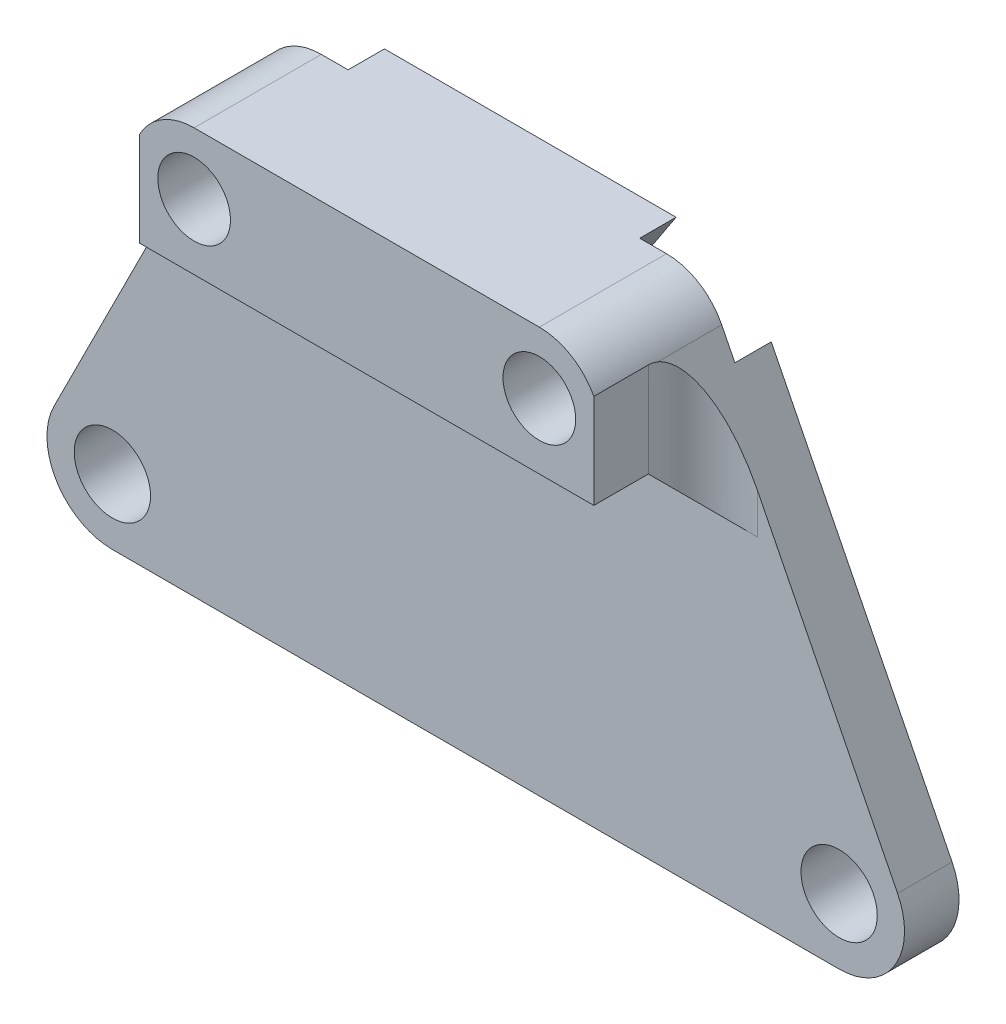
ISO-10303-21;
HEADER;
FILE_DESCRIPTION(('STEP AP214'),'2;1');
FILE_NAME('part.step','',(''),(''),'','','');
FILE_SCHEMA(('AUTOMOTIVE_DESIGN { 1 0 10303 214 1 1 1 1 }'));
ENDSEC;
DATA;
#1=APPLICATION_CONTEXT('core data for automotive mechanical design processes');
#2=APPLICATION_PROTOCOL_DEFINITION('international standard','automotive_design',2000,#1);
#3=PRODUCT_CONTEXT('',#1,'mechanical');
#4=PRODUCT('Part','Part','',(#3));
#5=PRODUCT_RELATED_PRODUCT_CATEGORY('part','',(#4));
#6=PRODUCT_DEFINITION_FORMATION('','',#4);
#7=PRODUCT_DEFINITION_CONTEXT('part definition',#1,'design');
#8=PRODUCT_DEFINITION('design','',#6,#7);
#9=PRODUCT_DEFINITION_SHAPE('','',#8);
#10=(LENGTH_UNIT() NAMED_UNIT(*) SI_UNIT(.MILLI.,.METRE.));
#11=(NAMED_UNIT(*) PLANE_ANGLE_UNIT() SI_UNIT($,.RADIAN.));
#12=(NAMED_UNIT(*) SI_UNIT($,.STERADIAN.) SOLID_ANGLE_UNIT());
#13=UNCERTAINTY_MEASURE_WITH_UNIT(LENGTH_MEASURE(1.E-05),#10,'distance_accuracy_value','');
#14=(GEOMETRIC_REPRESENTATION_CONTEXT(3) GLOBAL_UNCERTAINTY_ASSIGNED_CONTEXT((#13)) GLOBAL_UNIT_ASSIGNED_CONTEXT((#10,
#11,#12)) REPRESENTATION_CONTEXT('',''));
#15=CARTESIAN_POINT('',(0.,0.,0.));
#16=DIRECTION('',(0.,0.,1.));
#17=DIRECTION('',(1.,0.,0.));
#18=AXIS2_PLACEMENT_3D('',#15,#16,#17);
#19=CARTESIAN_POINT('',(36.5,32.6963519956689,3.));
#20=DIRECTION('',(0.,0.,-1.));
#21=DIRECTION('',(-1.,0.,0.));
#22=AXIS2_PLACEMENT_3D('',#19,#20,#21);
#23=CYLINDRICAL_SURFACE('',#22,2.);
#24=CARTESIAN_POINT('',(36.5,32.6963519956689,9.));
#25=DIRECTION('',(0.,0.,1.));
#26=DIRECTION('',(1.,0.,0.));
#27=AXIS2_PLACEMENT_3D('',#24,#25,#26);
#28=CIRCLE('',#27,2.);
#29=CARTESIAN_POINT('',(38.5,32.6963519956689,9.));
#30=VERTEX_POINT('',#29);
#31=EDGE_CURVE('E385',#30,#30,#28,.T.);
#32=ORIENTED_EDGE('',*,*,#31,.T.);
#33=EDGE_LOOP('',(#32));
#34=FACE_BOUND('',#33,.T.);
#35=CARTESIAN_POINT('',(36.5,32.6963519956689,2.));
#36=DIRECTION('',(0.,0.,-1.));
#37=DIRECTION('',(-1.,0.,0.));
#38=AXIS2_PLACEMENT_3D('',#35,#36,#37);
#39=CIRCLE('',#38,2.);
#40=CARTESIAN_POINT('',(34.5,32.6963519956689,2.));
#41=VERTEX_POINT('',#40);
#42=EDGE_CURVE('E296',#41,#41,#39,.T.);
#43=ORIENTED_EDGE('',*,*,#42,.T.);
#44=EDGE_LOOP('',(#43));
#45=FACE_BOUND('',#44,.T.);
#46=ADVANCED_FACE('F41',(#34,#45),#23,.F.);
#47=CARTESIAN_POINT('',(17.5,32.6963519956689,3.));
#48=DIRECTION('',(0.,0.,-1.));
#49=DIRECTION('',(-1.,0.,0.));
#50=AXIS2_PLACEMENT_3D('',#47,#48,#49);
#51=CYLINDRICAL_SURFACE('',#50,2.);
#52=CARTESIAN_POINT('',(17.5,32.6963519956689,9.));
#53=DIRECTION('',(0.,0.,1.));
#54=DIRECTION('',(1.,0.,0.));
#55=AXIS2_PLACEMENT_3D('',#52,#53,#54);
#56=CIRCLE('',#55,2.);
#57=CARTESIAN_POINT('',(19.5,32.6963519956689,9.));
#58=VERTEX_POINT('',#57);
#59=EDGE_CURVE('E389',#58,#58,#56,.T.);
#60=ORIENTED_EDGE('',*,*,#59,.T.);
#61=EDGE_LOOP('',(#60));
#62=FACE_BOUND('',#61,.T.);
#63=CARTESIAN_POINT('',(17.5,32.6963519956689,2.));
#64=DIRECTION('',(0.,0.,-1.));
#65=DIRECTION('',(-1.,0.,0.));
#66=AXIS2_PLACEMENT_3D('',#63,#64,#65);
#67=CIRCLE('',#66,2.);
#68=CARTESIAN_POINT('',(15.5,32.6963519956689,2.));
#69=VERTEX_POINT('',#68);
#70=EDGE_CURVE('E306',#69,#69,#67,.T.);
#71=ORIENTED_EDGE('',*,*,#70,.T.);
#72=EDGE_LOOP('',(#71));
#73=FACE_BOUND('',#72,.T.);
#74=ADVANCED_FACE('F513',(#62,#73),#51,.F.);
#75=CARTESIAN_POINT('',(36.5,32.6963519956689,9.001));
#76=DIRECTION('',(0.,0.,-1.));
#77=DIRECTION('',(-1.,0.,0.));
#78=AXIS2_PLACEMENT_3D('',#75,#76,#77);
#79=CYLINDRICAL_SURFACE('',#78,3.4);
#80=CARTESIAN_POINT('',(36.5,32.6963519956689,2.));
#81=DIRECTION('',(0.,0.,-1.));
#82=DIRECTION('',(-1.,0.,0.));
#83=AXIS2_PLACEMENT_3D('',#80,#81,#82);
#84=CIRCLE('',#83,3.4);
#85=CARTESIAN_POINT('',(36.5,36.0963519956689,2.));
#86=VERTEX_POINT('',#85);
#87=CARTESIAN_POINT('',(39.5382688625457,34.2224327009021,2.));
#88=VERTEX_POINT('',#87);
#89=EDGE_CURVE('E66',#86,#88,#84,.T.);
#90=ORIENTED_EDGE('',*,*,#89,.F.);
#91=DIRECTION('',(0.,0.,-1.));
#92=VECTOR('',#91,1.);
#93=CARTESIAN_POINT('',(36.5,36.0963519956689,9.001));
#94=LINE('',#93,#92);
#95=CARTESIAN_POINT('',(36.5,36.0963519956689,9.));
#96=VERTEX_POINT('',#95);
#97=EDGE_CURVE('E378',#96,#86,#94,.T.);
#98=ORIENTED_EDGE('',*,*,#97,.F.);
#99=CARTESIAN_POINT('',(36.5,32.6963519956689,9.));
#100=DIRECTION('',(0.,0.,-1.));
#101=DIRECTION('',(-1.,0.,0.));
#102=AXIS2_PLACEMENT_3D('',#99,#100,#101);
#103=CIRCLE('',#102,3.4);
#104=CARTESIAN_POINT('',(39.5,34.2963519956689,9.));
#105=VERTEX_POINT('',#104);
#106=EDGE_CURVE('E371',#96,#105,#103,.T.);
#107=ORIENTED_EDGE('',*,*,#106,.T.);
#108=DIRECTION('',(0.,0.,-1.));
#109=VECTOR('',#108,1.);
#110=CARTESIAN_POINT('',(39.5,34.2963519956689,9.001));
#111=LINE('',#110,#109);
#112=CARTESIAN_POINT('',(39.5,34.2963519956689,6.));
#113=VERTEX_POINT('',#112);
#114=EDGE_CURVE('E367',#105,#113,#111,.T.);
#115=ORIENTED_EDGE('',*,*,#114,.T.);
#116=CARTESIAN_POINT('',(39.5,34.2963519956689,6.));
#117=CARTESIAN_POINT('',(39.4999931355186,34.2963533426719,5.95924393558145));
#118=CARTESIAN_POINT('',(39.5008305355785,34.2947947685146,5.91848861310798));
#119=CARTESIAN_POINT('',(39.504129918685,34.288590938557,5.83758294139299));
#120=CARTESIAN_POINT('',(39.506579865277,34.2839685500584,5.79743034716024));
#121=CARTESIAN_POINT('',(39.5130418954618,34.2716698158187,5.71772316644448));
#122=CARTESIAN_POINT('',(39.5170539759645,34.2639934761186,5.67816857877869));
#123=CARTESIAN_POINT('',(39.5265660299673,34.2455449861682,5.59965582134393));
#124=CARTESIAN_POINT('',(39.5320768459241,34.2347502392404,5.56070427394639));
#125=CARTESIAN_POINT('',(39.5382688625458,34.2224327009024,5.52235089298296));
#126=B_SPLINE_CURVE_WITH_KNOTS('',3,(#116,#117,#118,#119,#120,#121,#122,#123,#124,#125),
.UNSPECIFIED.,.F.,.F.,(4,2,2,2,4),(0.,0.122228643838053,0.243555133983267,0.364881384132439,
0.487109844214449),.UNSPECIFIED.);
#127=CARTESIAN_POINT('',(39.5382688625457,34.2224327009021,5.52235089298296));
#128=VERTEX_POINT('',#127);
#129=EDGE_CURVE('E473',#113,#128,#126,.T.);
#130=ORIENTED_EDGE('',*,*,#129,.T.);
#131=DIRECTION('',(0.,0.,1.));
#132=VECTOR('',#131,1.);
#133=CARTESIAN_POINT('',(39.5382688625457,34.2224327009021,-0.00100000000000013));
#134=LINE('',#133,#132);
#135=EDGE_CURVE('E351',#88,#128,#134,.T.);
#136=ORIENTED_EDGE('',*,*,#135,.F.);
#137=EDGE_LOOP('',(#90,#98,#107,#115,#130,#136));
#138=FACE_BOUND('',#137,.T.);
#139=ADVANCED_FACE('F517',(#138),#79,.T.);
#140=CARTESIAN_POINT('',(17.5,32.6963519956689,9.001));
#141=DIRECTION('',(0.,0.,-1.));
#142=DIRECTION('',(-1.,0.,0.));
#143=AXIS2_PLACEMENT_3D('',#140,#141,#142);
#144=CYLINDRICAL_SURFACE('',#143,3.39999999999999);
#145=CARTESIAN_POINT('',(17.5,32.6963519956689,2.));
#146=DIRECTION('',(0.,0.,-1.));
#147=DIRECTION('',(-1.,0.,0.));
#148=AXIS2_PLACEMENT_3D('',#145,#146,#147);
#149=CIRCLE('',#148,3.39999999999999);
#150=CARTESIAN_POINT('',(14.4617311374543,34.2224327009022,2.));
#151=VERTEX_POINT('',#150);
#152=CARTESIAN_POINT('',(17.5,36.0963519956689,2.));
#153=VERTEX_POINT('',#152);
#154=EDGE_CURVE('E300',#151,#153,#149,.T.);
#155=ORIENTED_EDGE('',*,*,#154,.F.);
#156=DIRECTION('',(0.,0.,1.));
#157=VECTOR('',#156,1.);
#158=CARTESIAN_POINT('',(14.4617311374543,34.2224327009021,-0.00100000000000013));
#159=LINE('',#158,#157);
#160=CARTESIAN_POINT('',(14.4617311374543,34.2224327009021,5.5223508929831));
#161=VERTEX_POINT('',#160);
#162=EDGE_CURVE('E348',#151,#161,#159,.T.);
#163=ORIENTED_EDGE('',*,*,#162,.T.);
#164=CARTESIAN_POINT('',(14.4617311374543,34.2224327009021,5.5223508929831));
#165=CARTESIAN_POINT('',(14.4679231540759,34.2347502392403,5.56070427394649));
#166=CARTESIAN_POINT('',(14.4734339700327,34.2455449861681,5.599655821344));
#167=CARTESIAN_POINT('',(14.4829460240355,34.2639934761186,5.67816857877873));
#168=CARTESIAN_POINT('',(14.4869581045382,34.2716698158187,5.71772316644451));
#169=CARTESIAN_POINT('',(14.493420134723,34.2839685500584,5.79743034716024));
#170=CARTESIAN_POINT('',(14.495870081315,34.2885909385569,5.83758294139296));
#171=CARTESIAN_POINT('',(14.4991694644215,34.2947947685146,5.9184886131079));
#172=CARTESIAN_POINT('',(14.5000068644814,34.2963533426721,5.95924393558134));
#173=CARTESIAN_POINT('',(14.5,34.2963519956693,5.99999999999985));
#174=B_SPLINE_CURVE_WITH_KNOTS('',3,(#164,#165,#166,#167,#168,#169,#170,#171,#172,#173),
.UNSPECIFIED.,.F.,.F.,(4,2,2,2,4),(0.,0.122228460081969,0.243554710231111,0.364881200376254,
0.487109844214229),.UNSPECIFIED.);
#175=CARTESIAN_POINT('',(14.5,34.2963519956689,6.));
#176=VERTEX_POINT('',#175);
#177=EDGE_CURVE('E465',#161,#176,#174,.T.);
#178=ORIENTED_EDGE('',*,*,#177,.T.);
#179=DIRECTION('',(0.,0.,-1.));
#180=VECTOR('',#179,1.);
#181=CARTESIAN_POINT('',(14.5,34.2963519956689,9.001));
#182=LINE('',#181,#180);
#183=CARTESIAN_POINT('',(14.5,34.2963519956689,9.));
#184=VERTEX_POINT('',#183);
#185=EDGE_CURVE('E364',#176,#184,#182,.F.);
#186=ORIENTED_EDGE('',*,*,#185,.T.);
#187=CARTESIAN_POINT('',(17.5,32.6963519956689,9.));
#188=DIRECTION('',(0.,0.,-1.));
#189=DIRECTION('',(-1.,0.,0.));
#190=AXIS2_PLACEMENT_3D('',#187,#188,#189);
#191=CIRCLE('',#190,3.39999999999999);
#192=CARTESIAN_POINT('',(17.5,36.0963519956689,9.));
#193=VERTEX_POINT('',#192);
#194=EDGE_CURVE('E382',#184,#193,#191,.T.);
#195=ORIENTED_EDGE('',*,*,#194,.T.);
#196=DIRECTION('',(0.,0.,-1.));
#197=VECTOR('',#196,1.);
#198=CARTESIAN_POINT('',(17.5,36.0963519956689,9.001));
#199=LINE('',#198,#197);
#200=EDGE_CURVE('E374',#193,#153,#199,.T.);
#201=ORIENTED_EDGE('',*,*,#200,.T.);
#202=EDGE_LOOP('',(#155,#163,#178,#186,#195,#201));
#203=FACE_BOUND('',#202,.T.);
#204=ADVANCED_FACE('F480',(#203),#144,.T.);
#205=CARTESIAN_POINT('',(0.,0.,3.));
#206=DIRECTION('',(0.,0.,-1.));
#207=DIRECTION('',(-1.,0.,0.));
#208=AXIS2_PLACEMENT_3D('',#205,#206,#207);
#209=PLANE('',#208);
#210=CARTESIAN_POINT('',(47.,11.3463519956689,3.));
#211=DIRECTION('',(0.,0.,1.));
#212=DIRECTION('',(1.,0.,0.));
#213=AXIS2_PLACEMENT_3D('',#210,#211,#212);
#214=CIRCLE('',#213,2.1);
#215=CARTESIAN_POINT('',(49.1,11.3463519956689,3.));
#216=VERTEX_POINT('',#215);
#217=EDGE_CURVE('E416',#216,#216,#214,.T.);
#218=ORIENTED_EDGE('',*,*,#217,.F.);
#219=EDGE_LOOP('',(#218));
#220=FACE_BOUND('',#219,.T.);
#221=CARTESIAN_POINT('',(7.,11.3463519956689,3.));
#222=DIRECTION('',(0.,0.,1.));
#223=DIRECTION('',(1.,0.,0.));
#224=AXIS2_PLACEMENT_3D('',#221,#222,#223);
#225=CIRCLE('',#224,2.1);
#226=CARTESIAN_POINT('',(9.1,11.3463519956689,3.));
#227=VERTEX_POINT('',#226);
#228=EDGE_CURVE('E424',#227,#227,#225,.T.);
#229=ORIENTED_EDGE('',*,*,#228,.F.);
#230=EDGE_LOOP('',(#229));
#231=FACE_BOUND('',#230,.T.);
#232=DIRECTION('',(-1.,0.,0.));
#233=VECTOR('',#232,1.);
#234=CARTESIAN_POINT('',(14.5,26.0963519956689,3.));
#235=LINE('',#234,#233);
#236=CARTESIAN_POINT('',(42.5,26.0963519956689,3.));
#237=VERTEX_POINT('',#236);
#238=CARTESIAN_POINT('',(11.5,26.0963519956689,3.));
#239=VERTEX_POINT('',#238);
#240=EDGE_CURVE('E439',#237,#239,#235,.T.);
#241=ORIENTED_EDGE('',*,*,#240,.T.);
#242=DIRECTION('',(0.,-1.,0.));
#243=VECTOR('',#242,1.);
#244=CARTESIAN_POINT('',(11.5,34.2963519956689,3.));
#245=LINE('',#244,#243);
#246=CARTESIAN_POINT('',(11.5,28.3259322974165,3.));
#247=VERTEX_POINT('',#246);
#248=EDGE_CURVE('E450',#239,#247,#245,.F.);
#249=ORIENTED_EDGE('',*,*,#248,.T.);
#250=DIRECTION('',(-0.448847266245075,-0.893608488984031,0.));
#251=VECTOR('',#250,1.);
#252=CARTESIAN_POINT('',(3.78300943965748,12.9622021541512,3.));
#253=LINE('',#252,#251);
#254=CARTESIAN_POINT('',(3.78300943965748,12.9622021541512,3.));
#255=VERTEX_POINT('',#254);
#256=EDGE_CURVE('E339',#247,#255,#253,.T.);
#257=ORIENTED_EDGE('',*,*,#256,.T.);
#258=CARTESIAN_POINT('',(7.,11.3463519956689,3.));
#259=DIRECTION('',(0.,0.,1.));
#260=DIRECTION('',(1.,0.,0.));
#261=AXIS2_PLACEMENT_3D('',#258,#259,#260);
#262=CIRCLE('',#261,3.6);
#263=CARTESIAN_POINT('',(7.,7.74635199566891,3.));
#264=VERTEX_POINT('',#263);
#265=EDGE_CURVE('E323',#255,#264,#262,.T.);
#266=ORIENTED_EDGE('',*,*,#265,.T.);
#267=DIRECTION('',(1.,0.,0.));
#268=VECTOR('',#267,1.);
#269=CARTESIAN_POINT('',(47.,7.74635199566892,3.));
#270=LINE('',#269,#268);
#271=CARTESIAN_POINT('',(47.,7.74635199566892,3.));
#272=VERTEX_POINT('',#271);
#273=EDGE_CURVE('E327',#264,#272,#270,.T.);
#274=ORIENTED_EDGE('',*,*,#273,.T.);
#275=CARTESIAN_POINT('',(47.,11.3463519956689,3.));
#276=DIRECTION('',(0.,0.,1.));
#277=DIRECTION('',(1.,0.,0.));
#278=AXIS2_PLACEMENT_3D('',#275,#276,#277);
#279=CIRCLE('',#278,3.59999999999999);
#280=CARTESIAN_POINT('',(50.2169905603425,12.9622021541512,3.));
#281=VERTEX_POINT('',#280);
#282=EDGE_CURVE('E331',#272,#281,#279,.T.);
#283=ORIENTED_EDGE('',*,*,#282,.T.);
#284=DIRECTION('',(-0.448847266245074,0.893608488984031,0.));
#285=VECTOR('',#284,1.);
#286=CARTESIAN_POINT('',(39.5382688625457,34.2224327009021,3.));
#287=LINE('',#286,#285);
#288=CARTESIAN_POINT('',(42.5,28.3259322974165,3.));
#289=VERTEX_POINT('',#288);
#290=EDGE_CURVE('E335',#281,#289,#287,.T.);
#291=ORIENTED_EDGE('',*,*,#290,.T.);
#292=DIRECTION('',(0.,1.,0.));
#293=VECTOR('',#292,1.);
#294=CARTESIAN_POINT('',(42.5,26.0963519956689,3.));
#295=LINE('',#294,#293);
#296=EDGE_CURVE('E446',#289,#237,#295,.F.);
#297=ORIENTED_EDGE('',*,*,#296,.T.);
#298=EDGE_LOOP('',(#241,#249,#257,#266,#274,#283,#291,#297));
#299=FACE_BOUND('',#298,.T.);
#300=ADVANCED_FACE('F506',(#220,#231,#299),#209,.F.);
#301=CARTESIAN_POINT('',(0.,0.,0.));
#302=DIRECTION('',(0.,0.,-1.));
#303=DIRECTION('',(-1.,0.,0.));
#304=AXIS2_PLACEMENT_3D('',#301,#302,#303);
#305=PLANE('',#304);
#306=DIRECTION('',(-0.549464019375061,-0.835517379479447,0.));
#307=VECTOR('',#306,1.);
#308=CARTESIAN_POINT('',(40.0735267948245,32.488410705867,0.));
#309=LINE('',#308,#307);
#310=CARTESIAN_POINT('',(40.2638667145222,32.77784241624,0.));
#311=VERTEX_POINT('',#310);
#312=CARTESIAN_POINT('',(38.1066809579481,29.4976163653455,0.));
#313=VERTEX_POINT('',#312);
#314=EDGE_CURVE('E214',#311,#313,#309,.T.);
#315=ORIENTED_EDGE('',*,*,#314,.F.);
#316=DIRECTION('',(-0.448847266245074,0.893608488984031,0.));
#317=VECTOR('',#316,1.);
#318=CARTESIAN_POINT('',(39.5382688625457,34.2224327009021,0.));
#319=LINE('',#318,#317);
#320=CARTESIAN_POINT('',(50.2169905603425,12.9622021541512,0.));
#321=VERTEX_POINT('',#320);
#322=EDGE_CURVE('E313',#321,#311,#319,.T.);
#323=ORIENTED_EDGE('',*,*,#322,.F.);
#324=CARTESIAN_POINT('',(47.,11.3463519956689,0.));
#325=DIRECTION('',(0.,0.,-1.));
#326=DIRECTION('',(-1.,0.,0.));
#327=AXIS2_PLACEMENT_3D('',#324,#325,#326);
#328=CIRCLE('',#327,3.59999999999999);
#329=CARTESIAN_POINT('',(47.,7.74635199566892,0.));
#330=VERTEX_POINT('',#329);
#331=EDGE_CURVE('E310',#330,#321,#328,.F.);
#332=ORIENTED_EDGE('',*,*,#331,.F.);
#333=DIRECTION('',(1.,0.,0.));
#334=VECTOR('',#333,1.);
#335=CARTESIAN_POINT('',(47.,7.74635199566892,0.));
#336=LINE('',#335,#334);
#337=CARTESIAN_POINT('',(7.,7.74635199566891,0.));
#338=VERTEX_POINT('',#337);
#339=EDGE_CURVE('E347',#338,#330,#336,.T.);
#340=ORIENTED_EDGE('',*,*,#339,.F.);
#341=CARTESIAN_POINT('',(7.,11.3463519956689,0.));
#342=DIRECTION('',(0.,0.,-1.));
#343=DIRECTION('',(-1.,0.,0.));
#344=AXIS2_PLACEMENT_3D('',#341,#342,#343);
#345=CIRCLE('',#344,3.6);
#346=CARTESIAN_POINT('',(3.78300943965748,12.9622021541512,0.));
#347=VERTEX_POINT('',#346);
#348=EDGE_CURVE('E317',#347,#338,#345,.F.);
#349=ORIENTED_EDGE('',*,*,#348,.F.);
#350=DIRECTION('',(-0.448847266245075,-0.893608488984031,0.));
#351=VECTOR('',#350,1.);
#352=CARTESIAN_POINT('',(3.78300943965748,12.9622021541512,0.));
#353=LINE('',#352,#351);
#354=CARTESIAN_POINT('',(13.7361332854778,32.7778424162399,0.));
#355=VERTEX_POINT('',#354);
#356=EDGE_CURVE('E320',#355,#347,#353,.T.);
#357=ORIENTED_EDGE('',*,*,#356,.F.);
#358=DIRECTION('',(-0.549464019375061,0.835517379479447,0.));
#359=VECTOR('',#358,1.);
#360=CARTESIAN_POINT('',(13.9264732051754,32.488410705867,0.));
#361=LINE('',#360,#359);
#362=CARTESIAN_POINT('',(15.8933190420519,29.4976163653455,0.));
#363=VERTEX_POINT('',#362);
#364=EDGE_CURVE('E259',#363,#355,#361,.T.);
#365=ORIENTED_EDGE('',*,*,#364,.F.);
#366=DIRECTION('',(-0.998311285620135,-0.0580911095045852,0.));
#367=VECTOR('',#366,1.);
#368=CARTESIAN_POINT('',(15.8933190420519,29.4976163653455,0.));
#369=LINE('',#368,#367);
#370=CARTESIAN_POINT('',(19.4668458368765,29.7055576551475,0.));
#371=VERTEX_POINT('',#370);
#372=EDGE_CURVE('E277',#371,#363,#369,.T.);
#373=ORIENTED_EDGE('',*,*,#372,.F.);
#374=DIRECTION('',(-0.448847266245073,-0.893608488984032,0.));
#375=VECTOR('',#374,1.);
#376=CARTESIAN_POINT('',(19.4668458368765,29.7055576551475,0.));
#377=LINE('',#376,#375);
#378=CARTESIAN_POINT('',(21.0735267948245,32.9042932854709,0.));
#379=VERTEX_POINT('',#378);
#380=EDGE_CURVE('E273',#379,#371,#377,.T.);
#381=ORIENTED_EDGE('',*,*,#380,.F.);
#382=DIRECTION('',(0.549464019375062,-0.835517379479447,0.));
#383=VECTOR('',#382,1.);
#384=CARTESIAN_POINT('',(21.0735267948245,32.9042932854709,0.));
#385=LINE('',#384,#383);
#386=CARTESIAN_POINT('',(18.9743228140775,36.0963519956689,0.));
#387=VERTEX_POINT('',#386);
#388=EDGE_CURVE('E270',#387,#379,#385,.T.);
#389=ORIENTED_EDGE('',*,*,#388,.F.);
#390=DIRECTION('',(-1.,0.,0.));
#391=VECTOR('',#390,1.);
#392=CARTESIAN_POINT('',(54.,36.0963519956689,0.));
#393=LINE('',#392,#391);
#394=CARTESIAN_POINT('',(35.0256771859225,36.0963519956689,0.));
#395=VERTEX_POINT('',#394);
#396=EDGE_CURVE('E428',#395,#387,#393,.T.);
#397=ORIENTED_EDGE('',*,*,#396,.F.);
#398=DIRECTION('',(0.549464019375062,0.835517379479446,0.));
#399=VECTOR('',#398,1.);
#400=CARTESIAN_POINT('',(34.893319042052,35.8950876259923,0.));
#401=LINE('',#400,#399);
#402=CARTESIAN_POINT('',(32.9264732051755,32.9042932854709,0.));
#403=VERTEX_POINT('',#402);
#404=EDGE_CURVE('E246',#403,#395,#401,.T.);
#405=ORIENTED_EDGE('',*,*,#404,.F.);
#406=DIRECTION('',(-0.448847266245073,0.893608488984032,0.));
#407=VECTOR('',#406,1.);
#408=CARTESIAN_POINT('',(34.5331541631235,29.7055576551475,0.));
#409=LINE('',#408,#407);
#410=CARTESIAN_POINT('',(34.5331541631235,29.7055576551475,0.));
#411=VERTEX_POINT('',#410);
#412=EDGE_CURVE('E241',#411,#403,#409,.T.);
#413=ORIENTED_EDGE('',*,*,#412,.F.);
#414=DIRECTION('',(-0.998311285620135,0.0580911095045852,0.));
#415=VECTOR('',#414,1.);
#416=CARTESIAN_POINT('',(38.1066809579481,29.4976163653455,0.));
#417=LINE('',#416,#415);
#418=EDGE_CURVE('E238',#313,#411,#417,.T.);
#419=ORIENTED_EDGE('',*,*,#418,.F.);
#420=EDGE_LOOP('',(#315,#323,#332,#340,#349,#357,#365,#373,#381,#389,#397,#405,#413,#419));
#421=FACE_BOUND('',#420,.T.);
#422=CARTESIAN_POINT('',(47.,11.3463519956689,0.));
#423=DIRECTION('',(0.,0.,1.));
#424=DIRECTION('',(1.,0.,0.));
#425=AXIS2_PLACEMENT_3D('',#422,#423,#424);
#426=CIRCLE('',#425,2.1);
#427=CARTESIAN_POINT('',(49.1,11.3463519956689,0.));
#428=VERTEX_POINT('',#427);
#429=EDGE_CURVE('E415',#428,#428,#426,.T.);
#430=ORIENTED_EDGE('',*,*,#429,.T.);
#431=EDGE_LOOP('',(#430));
#432=FACE_BOUND('',#431,.T.);
#433=CARTESIAN_POINT('',(7.,11.3463519956689,0.));
#434=DIRECTION('',(0.,0.,1.));
#435=DIRECTION('',(1.,0.,0.));
#436=AXIS2_PLACEMENT_3D('',#433,#434,#435);
#437=CIRCLE('',#436,2.1);
#438=CARTESIAN_POINT('',(9.1,11.3463519956689,0.));
#439=VERTEX_POINT('',#438);
#440=EDGE_CURVE('E420',#439,#439,#437,.T.);
#441=ORIENTED_EDGE('',*,*,#440,.T.);
#442=EDGE_LOOP('',(#441));
#443=FACE_BOUND('',#442,.T.);
#444=ADVANCED_FACE('F502',(#421,#432,#443),#305,.T.);
#445=CARTESIAN_POINT('',(54.,36.0963519956689,3.));
#446=DIRECTION('',(0.,-1.,0.));
#447=DIRECTION('',(1.,0.,0.));
#448=AXIS2_PLACEMENT_3D('',#445,#446,#447);
#449=PLANE('',#448);
#450=DIRECTION('',(1.,0.,0.));
#451=VECTOR('',#450,1.);
#452=CARTESIAN_POINT('',(54.,36.0963519956689,2.));
#453=LINE('',#452,#451);
#454=CARTESIAN_POINT('',(35.0256771859225,36.0963519956689,2.));
#455=VERTEX_POINT('',#454);
#456=EDGE_CURVE('E293',#455,#86,#453,.T.);
#457=ORIENTED_EDGE('',*,*,#456,.F.);
#458=DIRECTION('',(0.,0.,-1.));
#459=VECTOR('',#458,1.);
#460=CARTESIAN_POINT('',(35.0256771859225,36.0963519956689,3.));
#461=LINE('',#460,#459);
#462=EDGE_CURVE('E11',#455,#395,#461,.T.);
#463=ORIENTED_EDGE('',*,*,#462,.T.);
#464=ORIENTED_EDGE('',*,*,#396,.T.);
#465=DIRECTION('',(0.,0.,1.));
#466=VECTOR('',#465,1.);
#467=CARTESIAN_POINT('',(18.9743228140775,36.0963519956689,3.));
#468=LINE('',#467,#466);
#469=CARTESIAN_POINT('',(18.9743228140775,36.0963519956689,2.));
#470=VERTEX_POINT('',#469);
#471=EDGE_CURVE('E51',#387,#470,#468,.T.);
#472=ORIENTED_EDGE('',*,*,#471,.T.);
#473=DIRECTION('',(1.,0.,0.));
#474=VECTOR('',#473,1.);
#475=CARTESIAN_POINT('',(54.,36.0963519956689,2.));
#476=LINE('',#475,#474);
#477=EDGE_CURVE('E303',#153,#470,#476,.T.);
#478=ORIENTED_EDGE('',*,*,#477,.F.);
#479=ORIENTED_EDGE('',*,*,#200,.F.);
#480=DIRECTION('',(-1.,0.,0.));
#481=VECTOR('',#480,1.);
#482=CARTESIAN_POINT('',(39.5,36.0963519956689,9.));
#483=LINE('',#482,#481);
#484=EDGE_CURVE('E397',#96,#193,#483,.T.);
#485=ORIENTED_EDGE('',*,*,#484,.F.);
#486=ORIENTED_EDGE('',*,*,#97,.T.);
#487=EDGE_LOOP('',(#457,#463,#464,#472,#478,#479,#485,#486));
#488=FACE_BOUND('',#487,.T.);
#489=ADVANCED_FACE('F498',(#488),#449,.F.);
#490=CARTESIAN_POINT('',(0.,0.,9.));
#491=DIRECTION('',(0.,0.,-1.));
#492=DIRECTION('',(-1.,0.,0.));
#493=AXIS2_PLACEMENT_3D('',#490,#491,#492);
#494=PLANE('',#493);
#495=ORIENTED_EDGE('',*,*,#59,.F.);
#496=EDGE_LOOP('',(#495));
#497=FACE_BOUND('',#496,.T.);
#498=ORIENTED_EDGE('',*,*,#31,.F.);
#499=EDGE_LOOP('',(#498));
#500=FACE_BOUND('',#499,.T.);
#501=DIRECTION('',(0.,1.,0.));
#502=VECTOR('',#501,1.);
#503=CARTESIAN_POINT('',(39.5,36.0963519956689,9.));
#504=LINE('',#503,#502);
#505=CARTESIAN_POINT('',(39.5,29.0963519956689,9.));
#506=VERTEX_POINT('',#505);
#507=EDGE_CURVE('E393',#506,#105,#504,.T.);
#508=ORIENTED_EDGE('',*,*,#507,.T.);
#509=ORIENTED_EDGE('',*,*,#106,.F.);
#510=ORIENTED_EDGE('',*,*,#484,.T.);
#511=ORIENTED_EDGE('',*,*,#194,.F.);
#512=DIRECTION('',(0.,-1.,0.));
#513=VECTOR('',#512,1.);
#514=CARTESIAN_POINT('',(14.5,36.0963519956689,9.));
#515=LINE('',#514,#513);
#516=CARTESIAN_POINT('',(14.5,29.0963519956689,9.));
#517=VERTEX_POINT('',#516);
#518=EDGE_CURVE('E401',#184,#517,#515,.T.);
#519=ORIENTED_EDGE('',*,*,#518,.T.);
#520=DIRECTION('',(1.,0.,0.));
#521=VECTOR('',#520,1.);
#522=CARTESIAN_POINT('',(39.5,29.0963519956689,9.));
#523=LINE('',#522,#521);
#524=EDGE_CURVE('E404',#517,#506,#523,.T.);
#525=ORIENTED_EDGE('',*,*,#524,.T.);
#526=EDGE_LOOP('',(#508,#509,#510,#511,#519,#525));
#527=FACE_BOUND('',#526,.T.);
#528=ADVANCED_FACE('F501',(#497,#500,#527),#494,.F.);
#529=CARTESIAN_POINT('',(39.5,36.0963519956689,9.));
#530=DIRECTION('',(-1.,0.,0.));
#531=DIRECTION('',(0.,-1.,0.));
#532=AXIS2_PLACEMENT_3D('',#529,#530,#531);
#533=PLANE('',#532);
#534=DIRECTION('',(0.,0.,-1.));
#535=VECTOR('',#534,1.);
#536=CARTESIAN_POINT('',(39.5,29.0963519956689,9.));
#537=LINE('',#536,#535);
#538=CARTESIAN_POINT('',(39.5,29.0963519956689,6.00000000000002));
#539=VERTEX_POINT('',#538);
#540=EDGE_CURVE('E407',#506,#539,#537,.T.);
#541=ORIENTED_EDGE('',*,*,#540,.T.);
#542=DIRECTION('',(0.,1.,0.));
#543=VECTOR('',#542,1.);
#544=CARTESIAN_POINT('',(39.5,34.2963519956689,6.));
#545=LINE('',#544,#543);
#546=EDGE_CURVE('E453',#539,#113,#545,.T.);
#547=ORIENTED_EDGE('',*,*,#546,.T.);
#548=ORIENTED_EDGE('',*,*,#114,.F.);
#549=ORIENTED_EDGE('',*,*,#507,.F.);
#550=EDGE_LOOP('',(#541,#547,#548,#549));
#551=FACE_BOUND('',#550,.T.);
#552=ADVANCED_FACE('F528',(#551),#533,.F.);
#553=CARTESIAN_POINT('',(14.5,36.0963519956689,9.));
#554=DIRECTION('',(1.,0.,0.));
#555=DIRECTION('',(0.,0.,-1.));
#556=AXIS2_PLACEMENT_3D('',#553,#554,#555);
#557=PLANE('',#556);
#558=ORIENTED_EDGE('',*,*,#185,.F.);
#559=DIRECTION('',(0.,-1.,0.));
#560=VECTOR('',#559,1.);
#561=CARTESIAN_POINT('',(14.5,26.0963519956689,6.));
#562=LINE('',#561,#560);
#563=CARTESIAN_POINT('',(14.5,29.0963519956689,6.00000000000002));
#564=VERTEX_POINT('',#563);
#565=EDGE_CURVE('E442',#176,#564,#562,.T.);
#566=ORIENTED_EDGE('',*,*,#565,.T.);
#567=DIRECTION('',(0.,0.,-1.));
#568=VECTOR('',#567,1.);
#569=CARTESIAN_POINT('',(14.5,29.0963519956689,9.));
#570=LINE('',#569,#568);
#571=EDGE_CURVE('E411',#517,#564,#570,.T.);
#572=ORIENTED_EDGE('',*,*,#571,.F.);
#573=ORIENTED_EDGE('',*,*,#518,.F.);
#574=EDGE_LOOP('',(#558,#566,#572,#573));
#575=FACE_BOUND('',#574,.T.);
#576=ADVANCED_FACE('F523',(#575),#557,.F.);
#577=CARTESIAN_POINT('',(7.,11.3463519956689,3.));
#578=DIRECTION('',(0.,0.,-1.));
#579=DIRECTION('',(-1.,0.,0.));
#580=AXIS2_PLACEMENT_3D('',#577,#578,#579);
#581=CYLINDRICAL_SURFACE('',#580,2.1);
#582=ORIENTED_EDGE('',*,*,#228,.T.);
#583=EDGE_LOOP('',(#582));
#584=FACE_BOUND('',#583,.T.);
#585=ORIENTED_EDGE('',*,*,#440,.F.);
#586=EDGE_LOOP('',(#585));
#587=FACE_BOUND('',#586,.T.);
#588=ADVANCED_FACE('F519',(#584,#587),#581,.F.);
#589=CARTESIAN_POINT('',(47.,11.3463519956689,3.));
#590=DIRECTION('',(0.,0.,-1.));
#591=DIRECTION('',(-1.,0.,0.));
#592=AXIS2_PLACEMENT_3D('',#589,#590,#591);
#593=CYLINDRICAL_SURFACE('',#592,2.1);
#594=ORIENTED_EDGE('',*,*,#217,.T.);
#595=EDGE_LOOP('',(#594));
#596=FACE_BOUND('',#595,.T.);
#597=ORIENTED_EDGE('',*,*,#429,.F.);
#598=EDGE_LOOP('',(#597));
#599=FACE_BOUND('',#598,.T.);
#600=ADVANCED_FACE('F522',(#596,#599),#593,.F.);
#601=CARTESIAN_POINT('',(39.5,29.0963519956689,9.));
#602=DIRECTION('',(0.,1.,0.));
#603=DIRECTION('',(-1.,0.,0.));
#604=AXIS2_PLACEMENT_3D('',#601,#602,#603);
#605=PLANE('',#604);
#606=ORIENTED_EDGE('',*,*,#571,.T.);
#607=DIRECTION('',(1.,0.,0.));
#608=VECTOR('',#607,1.);
#609=CARTESIAN_POINT('',(39.5,29.0963519956689,6.00000000000002));
#610=LINE('',#609,#608);
#611=EDGE_CURVE('E435',#564,#539,#610,.T.);
#612=ORIENTED_EDGE('',*,*,#611,.T.);
#613=ORIENTED_EDGE('',*,*,#540,.F.);
#614=ORIENTED_EDGE('',*,*,#524,.F.);
#615=EDGE_LOOP('',(#606,#612,#613,#614));
#616=FACE_BOUND('',#615,.T.);
#617=ADVANCED_FACE('F496',(#616),#605,.F.);
#618=CARTESIAN_POINT('',(39.5,29.0963519956689,6.00000000000002));
#619=DIRECTION('',(0.,-0.707106781186551,0.707106781186544));
#620=DIRECTION('',(-1.,0.,0.));
#621=AXIS2_PLACEMENT_3D('',#618,#619,#620);
#622=PLANE('',#621);
#623=ORIENTED_EDGE('',*,*,#611,.F.);
#624=CARTESIAN_POINT('',(11.5,29.0963519956689,6.));
#625=DIRECTION('',(0.,-0.707106781186551,0.707106781186544));
#626=DIRECTION('',(0.,0.707106781186544,0.707106781186551));
#627=AXIS2_PLACEMENT_3D('',#624,#625,#626);
#628=ELLIPSE('',#627,4.24264068711927,3.);
#629=EDGE_CURVE('E457',#564,#239,#628,.F.);
#630=ORIENTED_EDGE('',*,*,#629,.T.);
#631=ORIENTED_EDGE('',*,*,#240,.F.);
#632=CARTESIAN_POINT('',(42.5,29.0963519956689,6.));
#633=DIRECTION('',(0.,-0.707106781186551,0.707106781186544));
#634=DIRECTION('',(0.,-0.707106781186544,-0.707106781186551));
#635=AXIS2_PLACEMENT_3D('',#632,#633,#634);
#636=ELLIPSE('',#635,4.24264068711927,3.);
#637=EDGE_CURVE('E564',#237,#539,#636,.F.);
#638=ORIENTED_EDGE('',*,*,#637,.T.);
#639=EDGE_LOOP('',(#623,#630,#631,#638));
#640=FACE_BOUND('',#639,.T.);
#641=ADVANCED_FACE('F490',(#640),#622,.T.);
#642=CARTESIAN_POINT('',(7.,11.3463519956689,-0.00100000000000013));
#643=DIRECTION('',(0.,0.,1.));
#644=DIRECTION('',(1.,0.,0.));
#645=AXIS2_PLACEMENT_3D('',#642,#643,#644);
#646=CYLINDRICAL_SURFACE('',#645,3.6);
#647=DIRECTION('',(0.,0.,1.));
#648=VECTOR('',#647,1.);
#649=CARTESIAN_POINT('',(3.78300943965748,12.9622021541512,-0.00100000000000013));
#650=LINE('',#649,#648);
#651=EDGE_CURVE('E343',#347,#255,#650,.T.);
#652=ORIENTED_EDGE('',*,*,#651,.F.);
#653=ORIENTED_EDGE('',*,*,#348,.T.);
#654=DIRECTION('',(0.,0.,1.));
#655=VECTOR('',#654,1.);
#656=CARTESIAN_POINT('',(7.,7.74635199566891,-0.00100000000000013));
#657=LINE('',#656,#655);
#658=EDGE_CURVE('E342',#338,#264,#657,.T.);
#659=ORIENTED_EDGE('',*,*,#658,.T.);
#660=ORIENTED_EDGE('',*,*,#265,.F.);
#661=EDGE_LOOP('',(#652,#653,#659,#660));
#662=FACE_BOUND('',#661,.T.);
#663=ADVANCED_FACE('F495',(#662),#646,.T.);
#664=CARTESIAN_POINT('',(3.78300943965748,12.9622021541512,-0.00100000000000013));
#665=DIRECTION('',(-0.893608488984031,0.448847266245075,0.));
#666=DIRECTION('',(-0.448847266245075,-0.893608488984031,0.));
#667=AXIS2_PLACEMENT_3D('',#664,#665,#666);
#668=PLANE('',#667);
#669=DIRECTION('',(0.,0.,1.));
#670=VECTOR('',#669,1.);
#671=CARTESIAN_POINT('',(13.7361332854778,32.7778424162399,-0.00100000000000013));
#672=LINE('',#671,#670);
#673=CARTESIAN_POINT('',(13.7361332854778,32.77784241624,2.));
#674=VERTEX_POINT('',#673);
#675=EDGE_CURVE('E583',#355,#674,#672,.T.);
#676=ORIENTED_EDGE('',*,*,#675,.F.);
#677=ORIENTED_EDGE('',*,*,#356,.T.);
#678=ORIENTED_EDGE('',*,*,#651,.T.);
#679=ORIENTED_EDGE('',*,*,#256,.F.);
#680=CARTESIAN_POINT('',(11.5,28.3259322974165,6.));
#681=DIRECTION('',(-0.893608488984031,0.448847266245075,0.));
#682=DIRECTION('',(0.448847266245075,0.893608488984031,0.));
#683=AXIS2_PLACEMENT_3D('',#680,#681,#682);
#684=ELLIPSE('',#683,6.68378806246749,3.);
#685=EDGE_CURVE('E461',#247,#161,#684,.F.);
#686=ORIENTED_EDGE('',*,*,#685,.T.);
#687=ORIENTED_EDGE('',*,*,#162,.F.);
#688=DIRECTION('',(-0.448847266245075,-0.893608488984031,0.));
#689=VECTOR('',#688,1.);
#690=CARTESIAN_POINT('',(3.78300943965748,12.9622021541512,2.));
#691=LINE('',#690,#689);
#692=EDGE_CURVE('E579',#151,#674,#691,.T.);
#693=ORIENTED_EDGE('',*,*,#692,.T.);
#694=EDGE_LOOP('',(#676,#677,#678,#679,#686,#687,#693));
#695=FACE_BOUND('',#694,.T.);
#696=ADVANCED_FACE('F655',(#695),#668,.T.);
#697=CARTESIAN_POINT('',(39.5382688625457,34.2224327009021,-0.00100000000000013));
#698=DIRECTION('',(0.893608488984031,0.448847266245074,0.));
#699=DIRECTION('',(-0.448847266245074,0.893608488984031,0.));
#700=AXIS2_PLACEMENT_3D('',#697,#698,#699);
#701=PLANE('',#700);
#702=DIRECTION('',(0.,0.,-1.));
#703=VECTOR('',#702,1.);
#704=CARTESIAN_POINT('',(40.2638667145222,32.77784241624,-0.00100000000000013));
#705=LINE('',#704,#703);
#706=CARTESIAN_POINT('',(40.2638667145222,32.77784241624,2.));
#707=VERTEX_POINT('',#706);
#708=EDGE_CURVE('E576',#707,#311,#705,.T.);
#709=ORIENTED_EDGE('',*,*,#708,.F.);
#710=DIRECTION('',(-0.448847266245074,0.893608488984031,0.));
#711=VECTOR('',#710,1.);
#712=CARTESIAN_POINT('',(39.5382688625457,34.2224327009021,2.));
#713=LINE('',#712,#711);
#714=EDGE_CURVE('E210',#707,#88,#713,.T.);
#715=ORIENTED_EDGE('',*,*,#714,.T.);
#716=ORIENTED_EDGE('',*,*,#135,.T.);
#717=CARTESIAN_POINT('',(42.5,28.3259322974165,6.));
#718=DIRECTION('',(0.893608488984031,0.448847266245074,0.));
#719=DIRECTION('',(0.448847266245074,-0.893608488984031,0.));
#720=AXIS2_PLACEMENT_3D('',#717,#718,#719);
#721=ELLIPSE('',#720,6.68378806246751,3.);
#722=EDGE_CURVE('E566',#128,#289,#721,.F.);
#723=ORIENTED_EDGE('',*,*,#722,.T.);
#724=ORIENTED_EDGE('',*,*,#290,.F.);
#725=DIRECTION('',(0.,0.,1.));
#726=VECTOR('',#725,1.);
#727=CARTESIAN_POINT('',(50.2169905603425,12.9622021541512,-0.00100000000000013));
#728=LINE('',#727,#726);
#729=EDGE_CURVE('E354',#321,#281,#728,.T.);
#730=ORIENTED_EDGE('',*,*,#729,.F.);
#731=ORIENTED_EDGE('',*,*,#322,.T.);
#732=EDGE_LOOP('',(#709,#715,#716,#723,#724,#730,#731));
#733=FACE_BOUND('',#732,.T.);
#734=ADVANCED_FACE('F615',(#733),#701,.T.);
#735=CARTESIAN_POINT('',(47.,11.3463519956689,-0.00100000000000013));
#736=DIRECTION('',(0.,0.,1.));
#737=DIRECTION('',(1.,0.,0.));
#738=AXIS2_PLACEMENT_3D('',#735,#736,#737);
#739=CYLINDRICAL_SURFACE('',#738,3.59999999999999);
#740=DIRECTION('',(0.,0.,1.));
#741=VECTOR('',#740,1.);
#742=CARTESIAN_POINT('',(47.,7.74635199566892,-0.00100000000000013));
#743=LINE('',#742,#741);
#744=EDGE_CURVE('E357',#330,#272,#743,.T.);
#745=ORIENTED_EDGE('',*,*,#744,.F.);
#746=ORIENTED_EDGE('',*,*,#331,.T.);
#747=ORIENTED_EDGE('',*,*,#729,.T.);
#748=ORIENTED_EDGE('',*,*,#282,.F.);
#749=EDGE_LOOP('',(#745,#746,#747,#748));
#750=FACE_BOUND('',#749,.T.);
#751=ADVANCED_FACE('F661',(#750),#739,.T.);
#752=CARTESIAN_POINT('',(47.,7.74635199566892,-0.00100000000000013));
#753=DIRECTION('',(0.,-1.,0.));
#754=DIRECTION('',(1.,0.,0.));
#755=AXIS2_PLACEMENT_3D('',#752,#753,#754);
#756=PLANE('',#755);
#757=ORIENTED_EDGE('',*,*,#658,.F.);
#758=ORIENTED_EDGE('',*,*,#339,.T.);
#759=ORIENTED_EDGE('',*,*,#744,.T.);
#760=ORIENTED_EDGE('',*,*,#273,.F.);
#761=EDGE_LOOP('',(#757,#758,#759,#760));
#762=FACE_BOUND('',#761,.T.);
#763=ADVANCED_FACE('F487',(#762),#756,.T.);
#764=CARTESIAN_POINT('',(11.5,36.0963519956689,6.));
#765=DIRECTION('',(0.,1.,0.));
#766=DIRECTION('',(0.,0.,1.));
#767=AXIS2_PLACEMENT_3D('',#764,#765,#766);
#768=CYLINDRICAL_SURFACE('',#767,3.);
#769=ORIENTED_EDGE('',*,*,#685,.F.);
#770=ORIENTED_EDGE('',*,*,#248,.F.);
#771=ORIENTED_EDGE('',*,*,#629,.F.);
#772=ORIENTED_EDGE('',*,*,#565,.F.);
#773=ORIENTED_EDGE('',*,*,#177,.F.);
#774=EDGE_LOOP('',(#769,#770,#771,#772,#773));
#775=FACE_BOUND('',#774,.T.);
#776=ADVANCED_FACE('F483',(#775),#768,.F.);
#777=CARTESIAN_POINT('',(42.5,36.0963519956689,6.));
#778=DIRECTION('',(0.,-1.,0.));
#779=DIRECTION('',(1.,0.,0.));
#780=AXIS2_PLACEMENT_3D('',#777,#778,#779);
#781=CYLINDRICAL_SURFACE('',#780,3.);
#782=ORIENTED_EDGE('',*,*,#637,.F.);
#783=ORIENTED_EDGE('',*,*,#296,.F.);
#784=ORIENTED_EDGE('',*,*,#722,.F.);
#785=ORIENTED_EDGE('',*,*,#129,.F.);
#786=ORIENTED_EDGE('',*,*,#546,.F.);
#787=EDGE_LOOP('',(#782,#783,#784,#785,#786));
#788=FACE_BOUND('',#787,.T.);
#789=ADVANCED_FACE('F43',(#788),#781,.F.);
#790=CARTESIAN_POINT('',(34.893319042052,35.8950876259923,2.));
#791=DIRECTION('',(-0.835517379479446,0.549464019375062,0.));
#792=DIRECTION('',(-0.549464019375062,-0.835517379479446,0.));
#793=AXIS2_PLACEMENT_3D('',#790,#791,#792);
#794=PLANE('',#793);
#795=DIRECTION('',(0.549464019375062,0.835517379479447,0.));
#796=VECTOR('',#795,1.);
#797=CARTESIAN_POINT('',(32.9264732051755,32.9042932854709,2.));
#798=LINE('',#797,#796);
#799=CARTESIAN_POINT('',(32.9264732051755,32.9042932854709,2.));
#800=VERTEX_POINT('',#799);
#801=EDGE_CURVE('E225',#800,#455,#798,.T.);
#802=ORIENTED_EDGE('',*,*,#801,.F.);
#803=DIRECTION('',(0.,0.,-1.));
#804=VECTOR('',#803,1.);
#805=CARTESIAN_POINT('',(32.9264732051755,32.9042932854709,2.));
#806=LINE('',#805,#804);
#807=EDGE_CURVE('E251',#800,#403,#806,.T.);
#808=ORIENTED_EDGE('',*,*,#807,.T.);
#809=ORIENTED_EDGE('',*,*,#404,.T.);
#810=ORIENTED_EDGE('',*,*,#462,.F.);
#811=EDGE_LOOP('',(#802,#808,#809,#810));
#812=FACE_BOUND('',#811,.T.);
#813=ADVANCED_FACE('F625',(#812),#794,.F.);
#814=CARTESIAN_POINT('',(0.,0.,2.));
#815=DIRECTION('',(0.,0.,-1.));
#816=DIRECTION('',(-1.,0.,0.));
#817=AXIS2_PLACEMENT_3D('',#814,#815,#816);
#818=PLANE('',#817);
#819=ORIENTED_EDGE('',*,*,#42,.F.);
#820=EDGE_LOOP('',(#819));
#821=FACE_BOUND('',#820,.T.);
#822=ORIENTED_EDGE('',*,*,#456,.T.);
#823=ORIENTED_EDGE('',*,*,#89,.T.);
#824=ORIENTED_EDGE('',*,*,#714,.F.);
#825=DIRECTION('',(-0.549464019375061,-0.835517379479447,0.));
#826=VECTOR('',#825,1.);
#827=CARTESIAN_POINT('',(40.0735267948245,32.488410705867,2.));
#828=LINE('',#827,#826);
#829=CARTESIAN_POINT('',(38.1066809579481,29.4976163653455,2.));
#830=VERTEX_POINT('',#829);
#831=EDGE_CURVE('E204',#707,#830,#828,.T.);
#832=ORIENTED_EDGE('',*,*,#831,.T.);
#833=DIRECTION('',(-0.998311285620135,0.0580911095045852,0.));
#834=VECTOR('',#833,1.);
#835=CARTESIAN_POINT('',(38.1066809579481,29.4976163653455,2.));
#836=LINE('',#835,#834);
#837=CARTESIAN_POINT('',(34.5331541631235,29.7055576551475,2.));
#838=VERTEX_POINT('',#837);
#839=EDGE_CURVE('E209',#830,#838,#836,.T.);
#840=ORIENTED_EDGE('',*,*,#839,.T.);
#841=DIRECTION('',(-0.448847266245073,0.893608488984032,0.));
#842=VECTOR('',#841,1.);
#843=CARTESIAN_POINT('',(34.5331541631235,29.7055576551475,2.));
#844=LINE('',#843,#842);
#845=EDGE_CURVE('E230',#838,#800,#844,.T.);
#846=ORIENTED_EDGE('',*,*,#845,.T.);
#847=ORIENTED_EDGE('',*,*,#801,.T.);
#848=EDGE_LOOP('',(#822,#823,#824,#832,#840,#846,#847));
#849=FACE_BOUND('',#848,.T.);
#850=ADVANCED_FACE('F206',(#821,#849),#818,.T.);
#851=CARTESIAN_POINT('',(40.0735267948245,32.488410705867,2.));
#852=DIRECTION('',(0.835517379479447,-0.549464019375061,0.));
#853=DIRECTION('',(0.549464019375061,0.835517379479447,0.));
#854=AXIS2_PLACEMENT_3D('',#851,#852,#853);
#855=PLANE('',#854);
#856=ORIENTED_EDGE('',*,*,#708,.T.);
#857=ORIENTED_EDGE('',*,*,#314,.T.);
#858=DIRECTION('',(0.,0.,-1.));
#859=VECTOR('',#858,1.);
#860=CARTESIAN_POINT('',(38.1066809579481,29.4976163653455,2.));
#861=LINE('',#860,#859);
#862=EDGE_CURVE('E217',#830,#313,#861,.T.);
#863=ORIENTED_EDGE('',*,*,#862,.F.);
#864=ORIENTED_EDGE('',*,*,#831,.F.);
#865=EDGE_LOOP('',(#856,#857,#863,#864));
#866=FACE_BOUND('',#865,.T.);
#867=ADVANCED_FACE('F218',(#866),#855,.F.);
#868=CARTESIAN_POINT('',(34.5331541631235,29.7055576551475,2.));
#869=DIRECTION('',(-0.893608488984032,-0.448847266245073,0.));
#870=DIRECTION('',(0.448847266245073,-0.893608488984032,0.));
#871=AXIS2_PLACEMENT_3D('',#868,#869,#870);
#872=PLANE('',#871);
#873=ORIENTED_EDGE('',*,*,#412,.T.);
#874=ORIENTED_EDGE('',*,*,#807,.F.);
#875=ORIENTED_EDGE('',*,*,#845,.F.);
#876=DIRECTION('',(0.,0.,-1.));
#877=VECTOR('',#876,1.);
#878=CARTESIAN_POINT('',(34.5331541631235,29.7055576551475,2.));
#879=LINE('',#878,#877);
#880=EDGE_CURVE('E224',#838,#411,#879,.T.);
#881=ORIENTED_EDGE('',*,*,#880,.T.);
#882=EDGE_LOOP('',(#873,#874,#875,#881));
#883=FACE_BOUND('',#882,.T.);
#884=ADVANCED_FACE('F622',(#883),#872,.F.);
#885=CARTESIAN_POINT('',(38.1066809579481,29.4976163653455,2.));
#886=DIRECTION('',(-0.0580911095045852,-0.998311285620135,0.));
#887=DIRECTION('',(0.998311285620135,-0.0580911095045852,0.));
#888=AXIS2_PLACEMENT_3D('',#885,#886,#887);
#889=PLANE('',#888);
#890=ORIENTED_EDGE('',*,*,#418,.T.);
#891=ORIENTED_EDGE('',*,*,#880,.F.);
#892=ORIENTED_EDGE('',*,*,#839,.F.);
#893=ORIENTED_EDGE('',*,*,#862,.T.);
#894=EDGE_LOOP('',(#890,#891,#892,#893));
#895=FACE_BOUND('',#894,.T.);
#896=ADVANCED_FACE('F227',(#895),#889,.F.);
#897=CARTESIAN_POINT('',(21.0735267948245,32.9042932854709,2.));
#898=DIRECTION('',(0.835517379479447,0.549464019375062,0.));
#899=DIRECTION('',(-0.549464019375062,0.835517379479447,0.));
#900=AXIS2_PLACEMENT_3D('',#897,#898,#899);
#901=PLANE('',#900);
#902=ORIENTED_EDGE('',*,*,#388,.T.);
#903=DIRECTION('',(0.,0.,-1.));
#904=VECTOR('',#903,1.);
#905=CARTESIAN_POINT('',(21.0735267948245,32.9042932854709,2.));
#906=LINE('',#905,#904);
#907=CARTESIAN_POINT('',(21.0735267948245,32.9042932854709,2.));
#908=VERTEX_POINT('',#907);
#909=EDGE_CURVE('E269',#908,#379,#906,.T.);
#910=ORIENTED_EDGE('',*,*,#909,.F.);
#911=DIRECTION('',(0.549464019375062,-0.835517379479446,0.));
#912=VECTOR('',#911,1.);
#913=CARTESIAN_POINT('',(19.106680957948,35.8950876259923,2.));
#914=LINE('',#913,#912);
#915=EDGE_CURVE('E258',#470,#908,#914,.T.);
#916=ORIENTED_EDGE('',*,*,#915,.F.);
#917=ORIENTED_EDGE('',*,*,#471,.F.);
#918=EDGE_LOOP('',(#902,#910,#916,#917));
#919=FACE_BOUND('',#918,.T.);
#920=ADVANCED_FACE('F591',(#919),#901,.F.);
#921=CARTESIAN_POINT('',(0.,0.,2.));
#922=DIRECTION('',(0.,0.,-1.));
#923=DIRECTION('',(-1.,0.,0.));
#924=AXIS2_PLACEMENT_3D('',#921,#922,#923);
#925=PLANE('',#924);
#926=ORIENTED_EDGE('',*,*,#70,.F.);
#927=EDGE_LOOP('',(#926));
#928=FACE_BOUND('',#927,.T.);
#929=ORIENTED_EDGE('',*,*,#477,.T.);
#930=ORIENTED_EDGE('',*,*,#915,.T.);
#931=DIRECTION('',(-0.448847266245073,-0.893608488984032,0.));
#932=VECTOR('',#931,1.);
#933=CARTESIAN_POINT('',(19.4668458368765,29.7055576551475,2.));
#934=LINE('',#933,#932);
#935=CARTESIAN_POINT('',(19.4668458368765,29.7055576551475,2.));
#936=VERTEX_POINT('',#935);
#937=EDGE_CURVE('E262',#908,#936,#934,.T.);
#938=ORIENTED_EDGE('',*,*,#937,.T.);
#939=DIRECTION('',(-0.998311285620135,-0.0580911095045852,0.));
#940=VECTOR('',#939,1.);
#941=CARTESIAN_POINT('',(15.8933190420519,29.4976163653455,2.));
#942=LINE('',#941,#940);
#943=CARTESIAN_POINT('',(15.8933190420519,29.4976163653455,2.));
#944=VERTEX_POINT('',#943);
#945=EDGE_CURVE('E266',#936,#944,#942,.T.);
#946=ORIENTED_EDGE('',*,*,#945,.T.);
#947=DIRECTION('',(-0.549464019375061,0.835517379479447,0.));
#948=VECTOR('',#947,1.);
#949=CARTESIAN_POINT('',(13.9264732051754,32.488410705867,2.));
#950=LINE('',#949,#948);
#951=EDGE_CURVE('E58',#944,#674,#950,.T.);
#952=ORIENTED_EDGE('',*,*,#951,.T.);
#953=ORIENTED_EDGE('',*,*,#692,.F.);
#954=ORIENTED_EDGE('',*,*,#154,.T.);
#955=EDGE_LOOP('',(#929,#930,#938,#946,#952,#953,#954));
#956=FACE_BOUND('',#955,.T.);
#957=ADVANCED_FACE('F602',(#928,#956),#925,.T.);
#958=CARTESIAN_POINT('',(13.9264732051754,32.488410705867,2.));
#959=DIRECTION('',(-0.835517379479447,-0.549464019375061,0.));
#960=DIRECTION('',(0.549464019375061,-0.835517379479447,0.));
#961=AXIS2_PLACEMENT_3D('',#958,#959,#960);
#962=PLANE('',#961);
#963=ORIENTED_EDGE('',*,*,#675,.T.);
#964=ORIENTED_EDGE('',*,*,#951,.F.);
#965=DIRECTION('',(0.,0.,-1.));
#966=VECTOR('',#965,1.);
#967=CARTESIAN_POINT('',(15.8933190420519,29.4976163653455,2.));
#968=LINE('',#967,#966);
#969=EDGE_CURVE('E242',#944,#363,#968,.T.);
#970=ORIENTED_EDGE('',*,*,#969,.T.);
#971=ORIENTED_EDGE('',*,*,#364,.T.);
#972=EDGE_LOOP('',(#963,#964,#970,#971));
#973=FACE_BOUND('',#972,.T.);
#974=ADVANCED_FACE('F642',(#973),#962,.F.);
#975=CARTESIAN_POINT('',(15.8933190420519,29.4976163653455,2.));
#976=DIRECTION('',(0.0580911095045852,-0.998311285620135,0.));
#977=DIRECTION('',(0.998311285620135,0.0580911095045852,0.));
#978=AXIS2_PLACEMENT_3D('',#975,#976,#977);
#979=PLANE('',#978);
#980=ORIENTED_EDGE('',*,*,#372,.T.);
#981=ORIENTED_EDGE('',*,*,#969,.F.);
#982=ORIENTED_EDGE('',*,*,#945,.F.);
#983=DIRECTION('',(0.,0.,-1.));
#984=VECTOR('',#983,1.);
#985=CARTESIAN_POINT('',(19.4668458368765,29.7055576551475,2.));
#986=LINE('',#985,#984);
#987=EDGE_CURVE('E285',#936,#371,#986,.T.);
#988=ORIENTED_EDGE('',*,*,#987,.T.);
#989=EDGE_LOOP('',(#980,#981,#982,#988));
#990=FACE_BOUND('',#989,.T.);
#991=ADVANCED_FACE('F646',(#990),#979,.F.);
#992=CARTESIAN_POINT('',(19.4668458368765,29.7055576551475,2.));
#993=DIRECTION('',(0.893608488984032,-0.448847266245073,0.));
#994=DIRECTION('',(0.448847266245073,0.893608488984032,0.));
#995=AXIS2_PLACEMENT_3D('',#992,#993,#994);
#996=PLANE('',#995);
#997=ORIENTED_EDGE('',*,*,#380,.T.);
#998=ORIENTED_EDGE('',*,*,#987,.F.);
#999=ORIENTED_EDGE('',*,*,#937,.F.);
#1000=ORIENTED_EDGE('',*,*,#909,.T.);
#1001=EDGE_LOOP('',(#997,#998,#999,#1000));
#1002=FACE_BOUND('',#1001,.T.);
#1003=ADVANCED_FACE('F599',(#1002),#996,.F.);
#1004=CLOSED_SHELL('',(#46,#74,#139,#204,#300,#444,#489,#528,#552,#576,#588,#600,#617,#641,#663,
#696,#734,#751,#763,#776,#789,#813,#850,#867,#884,#896,#920,#957,#974,#991,#1003));
#1005=MANIFOLD_SOLID_BREP('B2',#1004);
#1006=ADVANCED_BREP_SHAPE_REPRESENTATION('',(#18,#1005),#14);
#1007=SHAPE_DEFINITION_REPRESENTATION(#9,#1006);
ENDSEC;
END-ISO-10303-21;
